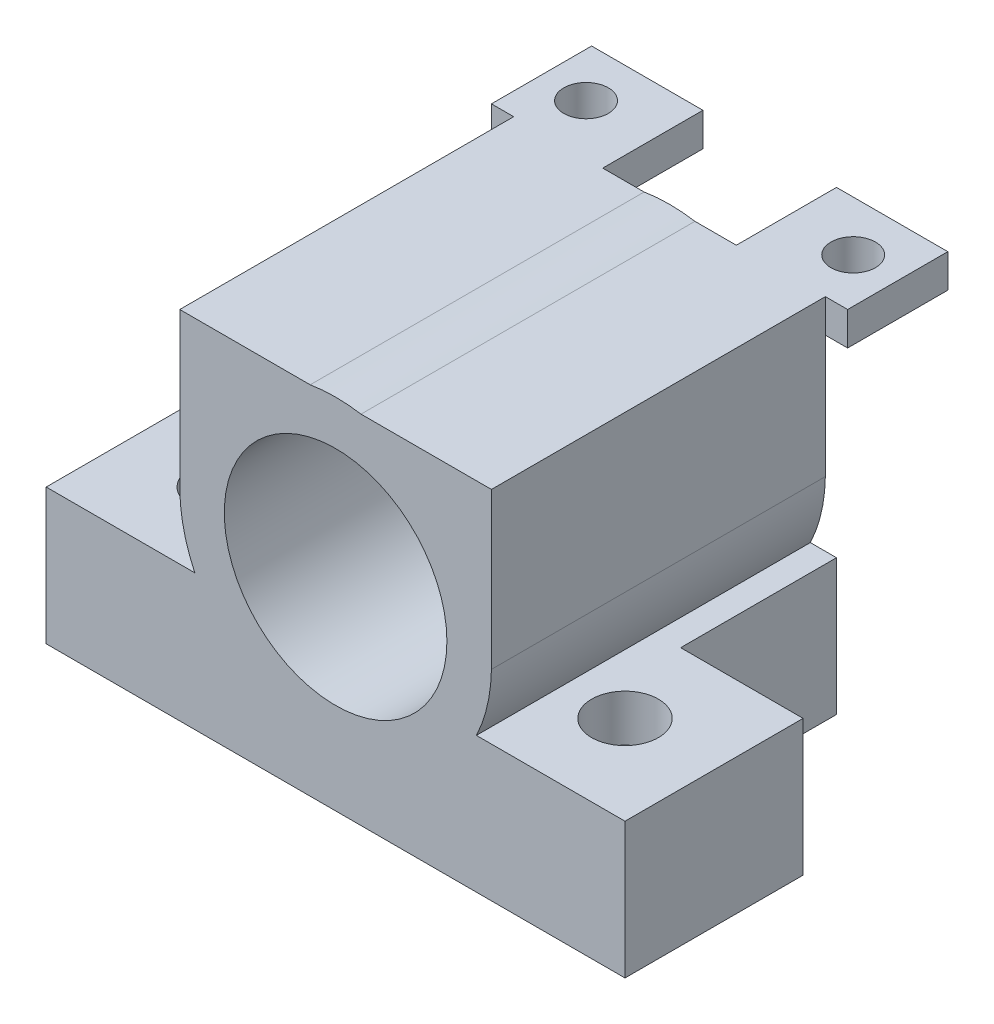
ISO-10303-21;
HEADER;
FILE_DESCRIPTION(('STEP AP214'),'2;1');
FILE_NAME('part.step','',(''),(''),'','','');
FILE_SCHEMA(('AUTOMOTIVE_DESIGN { 1 0 10303 214 1 1 1 1 }'));
ENDSEC;
DATA;
#1=APPLICATION_CONTEXT('core data for automotive mechanical design processes');
#2=APPLICATION_PROTOCOL_DEFINITION('international standard','automotive_design',2000,#1);
#3=PRODUCT_CONTEXT('',#1,'mechanical');
#4=PRODUCT('Part','Part','',(#3));
#5=PRODUCT_RELATED_PRODUCT_CATEGORY('part','',(#4));
#6=PRODUCT_DEFINITION_FORMATION('','',#4);
#7=PRODUCT_DEFINITION_CONTEXT('part definition',#1,'design');
#8=PRODUCT_DEFINITION('design','',#6,#7);
#9=PRODUCT_DEFINITION_SHAPE('','',#8);
#10=(LENGTH_UNIT() NAMED_UNIT(*) SI_UNIT(.MILLI.,.METRE.));
#11=(NAMED_UNIT(*) PLANE_ANGLE_UNIT() SI_UNIT($,.RADIAN.));
#12=(NAMED_UNIT(*) SI_UNIT($,.STERADIAN.) SOLID_ANGLE_UNIT());
#13=UNCERTAINTY_MEASURE_WITH_UNIT(LENGTH_MEASURE(1.E-05),#10,'distance_accuracy_value','');
#14=(GEOMETRIC_REPRESENTATION_CONTEXT(3) GLOBAL_UNCERTAINTY_ASSIGNED_CONTEXT((#13)) GLOBAL_UNIT_ASSIGNED_CONTEXT((#10,
#11,#12)) REPRESENTATION_CONTEXT('',''));
#15=CARTESIAN_POINT('',(0.,0.,0.));
#16=DIRECTION('',(0.,0.,1.));
#17=DIRECTION('',(1.,0.,0.));
#18=AXIS2_PLACEMENT_3D('',#15,#16,#17);
#19=CARTESIAN_POINT('',(0.,5.40634432154472,0.));
#20=DIRECTION('',(0.,1.,0.));
#21=DIRECTION('',(-1.,0.,0.));
#22=AXIS2_PLACEMENT_3D('',#19,#20,#21);
#23=PLANE('',#22);
#24=CARTESIAN_POINT('',(6.00000000000014,5.40634432154476,-9.25000000000001));
#25=DIRECTION('',(0.,1.,0.));
#26=DIRECTION('',(-1.,0.,0.));
#27=AXIS2_PLACEMENT_3D('',#24,#25,#26);
#28=CIRCLE('',#27,1.);
#29=CARTESIAN_POINT('',(5.00000000000014,5.40634432154475,-9.25000000000001));
#30=VERTEX_POINT('',#29);
#31=EDGE_CURVE('E312',#30,#30,#28,.T.);
#32=ORIENTED_EDGE('',*,*,#31,.T.);
#33=EDGE_LOOP('',(#32));
#34=FACE_BOUND('',#33,.T.);
#35=DIRECTION('',(-1.,0.,0.));
#36=VECTOR('',#35,1.);
#37=CARTESIAN_POINT('',(0.,5.40634432154472,-7.));
#38=LINE('',#37,#36);
#39=CARTESIAN_POINT('',(8.00000000000012,5.40634432154477,-6.99999999999999));
#40=VERTEX_POINT('',#39);
#41=CARTESIAN_POINT('',(6.99999999999996,5.40634432154476,-6.99999999999999));
#42=VERTEX_POINT('',#41);
#43=EDGE_CURVE('E302',#40,#42,#38,.T.);
#44=ORIENTED_EDGE('',*,*,#43,.T.);
#45=DIRECTION('',(1.,0.,0.));
#46=VECTOR('',#45,1.);
#47=CARTESIAN_POINT('',(0.,5.40634432154472,-7.));
#48=LINE('',#47,#46);
#49=CARTESIAN_POINT('',(3.00000000000012,5.40634432154474,-7.));
#50=VERTEX_POINT('',#49);
#51=EDGE_CURVE('E39',#50,#42,#48,.T.);
#52=ORIENTED_EDGE('',*,*,#51,.F.);
#53=DIRECTION('',(0.,0.,-1.));
#54=VECTOR('',#53,1.);
#55=CARTESIAN_POINT('',(3.00000000000005,5.40634432154474,0.));
#56=LINE('',#55,#54);
#57=CARTESIAN_POINT('',(3.00000000000017,5.40634432154474,-11.5));
#58=VERTEX_POINT('',#57);
#59=EDGE_CURVE('E309',#50,#58,#56,.T.);
#60=ORIENTED_EDGE('',*,*,#59,.T.);
#61=DIRECTION('',(1.,0.,0.));
#62=VECTOR('',#61,1.);
#63=CARTESIAN_POINT('',(0.,5.40634432154472,-11.5000000000001));
#64=LINE('',#63,#62);
#65=CARTESIAN_POINT('',(8.00000000000017,5.40634432154477,-11.5));
#66=VERTEX_POINT('',#65);
#67=EDGE_CURVE('E307',#58,#66,#64,.T.);
#68=ORIENTED_EDGE('',*,*,#67,.T.);
#69=DIRECTION('',(0.,0.,1.));
#70=VECTOR('',#69,1.);
#71=CARTESIAN_POINT('',(8.00000000000004,5.40634432154477,0.));
#72=LINE('',#71,#70);
#73=EDGE_CURVE('E305',#66,#40,#72,.T.);
#74=ORIENTED_EDGE('',*,*,#73,.T.);
#75=EDGE_LOOP('',(#44,#52,#60,#68,#74));
#76=FACE_BOUND('',#75,.T.);
#77=ADVANCED_FACE('F35',(#34,#76),#23,.F.);
#78=CARTESIAN_POINT('',(0.,0.,0.));
#79=DIRECTION('',(0.,0.,1.));
#80=DIRECTION('',(1.,0.,0.));
#81=AXIS2_PLACEMENT_3D('',#78,#79,#80);
#82=CYLINDRICAL_SURFACE('',#81,5.);
#83=CARTESIAN_POINT('',(0.,0.,8.));
#84=DIRECTION('',(0.,0.,1.));
#85=DIRECTION('',(1.,0.,0.));
#86=AXIS2_PLACEMENT_3D('',#83,#84,#85);
#87=CIRCLE('',#86,5.);
#88=CARTESIAN_POINT('',(5.,0.,8.));
#89=VERTEX_POINT('',#88);
#90=EDGE_CURVE('E424',#89,#89,#87,.T.);
#91=ORIENTED_EDGE('',*,*,#90,.T.);
#92=EDGE_LOOP('',(#91));
#93=FACE_BOUND('',#92,.T.);
#94=CARTESIAN_POINT('',(0.,0.,-7.));
#95=DIRECTION('',(0.,0.,-1.));
#96=DIRECTION('',(-1.,0.,0.));
#97=AXIS2_PLACEMENT_3D('',#94,#95,#96);
#98=CIRCLE('',#97,5.);
#99=CARTESIAN_POINT('',(-5.,0.,-7.));
#100=VERTEX_POINT('',#99);
#101=EDGE_CURVE('E414',#100,#100,#98,.F.);
#102=ORIENTED_EDGE('',*,*,#101,.F.);
#103=EDGE_LOOP('',(#102));
#104=FACE_BOUND('',#103,.T.);
#105=ADVANCED_FACE('F520',(#93,#104),#82,.F.);
#106=CARTESIAN_POINT('',(-6.00000000000002,5.40634432154468,-9.25000000000014));
#107=DIRECTION('',(0.,1.,0.));
#108=DIRECTION('',(-1.,0.,0.));
#109=AXIS2_PLACEMENT_3D('',#106,#107,#108);
#110=CIRCLE('',#109,1.);
#111=CARTESIAN_POINT('',(-7.00000000000002,5.40634432154467,-9.25000000000014));
#112=VERTEX_POINT('',#111);
#113=EDGE_CURVE('E291',#112,#112,#110,.T.);
#114=ORIENTED_EDGE('',*,*,#113,.T.);
#115=EDGE_LOOP('',(#114));
#116=FACE_BOUND('',#115,.T.);
#117=CARTESIAN_POINT('',(-7.00000000000004,5.40634432154467,-7.));
#118=VERTEX_POINT('',#117);
#119=CARTESIAN_POINT('',(-3.00000000000001,5.4063443215447,-7.));
#120=VERTEX_POINT('',#119);
#121=EDGE_CURVE('E11',#118,#120,#48,.T.);
#122=ORIENTED_EDGE('',*,*,#121,.F.);
#123=DIRECTION('',(-1.,0.,0.));
#124=VECTOR('',#123,1.);
#125=CARTESIAN_POINT('',(0.,5.40634432154472,-6.99999999999993));
#126=LINE('',#125,#124);
#127=CARTESIAN_POINT('',(-8.00000000000004,5.40634432154466,-7.00000000000001));
#128=VERTEX_POINT('',#127);
#129=EDGE_CURVE('E300',#118,#128,#126,.T.);
#130=ORIENTED_EDGE('',*,*,#129,.T.);
#131=DIRECTION('',(0.,0.,1.));
#132=VECTOR('',#131,1.);
#133=CARTESIAN_POINT('',(-8.00000000000011,5.40634432154466,0.));
#134=LINE('',#133,#132);
#135=CARTESIAN_POINT('',(-7.99999999999999,5.40634432154466,-11.5000000000002));
#136=VERTEX_POINT('',#135);
#137=EDGE_CURVE('E297',#136,#128,#134,.T.);
#138=ORIENTED_EDGE('',*,*,#137,.F.);
#139=DIRECTION('',(1.,0.,0.));
#140=VECTOR('',#139,1.);
#141=CARTESIAN_POINT('',(0.,5.40634432154472,-11.5000000000001));
#142=LINE('',#141,#140);
#143=CARTESIAN_POINT('',(-2.99999999999999,5.4063443215447,-11.5000000000001));
#144=VERTEX_POINT('',#143);
#145=EDGE_CURVE('E294',#136,#144,#142,.T.);
#146=ORIENTED_EDGE('',*,*,#145,.T.);
#147=DIRECTION('',(0.,0.,-1.));
#148=VECTOR('',#147,1.);
#149=CARTESIAN_POINT('',(-3.00000000000011,5.4063443215447,0.));
#150=LINE('',#149,#148);
#151=EDGE_CURVE('E50',#120,#144,#150,.T.);
#152=ORIENTED_EDGE('',*,*,#151,.F.);
#153=EDGE_LOOP('',(#122,#130,#138,#146,#152));
#154=FACE_BOUND('',#153,.T.);
#155=ADVANCED_FACE('F523',(#116,#154),#23,.F.);
#156=CARTESIAN_POINT('',(0.,0.,8.));
#157=DIRECTION('',(0.,0.,-1.));
#158=DIRECTION('',(-1.,0.,0.));
#159=AXIS2_PLACEMENT_3D('',#156,#157,#158);
#160=CYLINDRICAL_SURFACE('',#159,7.);
#161=CARTESIAN_POINT('',(0.,0.,-7.));
#162=DIRECTION('',(0.,0.,-1.));
#163=DIRECTION('',(-1.,0.,0.));
#164=AXIS2_PLACEMENT_3D('',#161,#162,#163);
#165=CIRCLE('',#164,7.);
#166=CARTESIAN_POINT('',(6.99937344438008,-0.0936556784552351,-6.99999999999999));
#167=VERTEX_POINT('',#166);
#168=CARTESIAN_POINT('',(6.32455532033676,-3.,-7.));
#169=VERTEX_POINT('',#168);
#170=EDGE_CURVE('E405',#167,#169,#165,.T.);
#171=ORIENTED_EDGE('',*,*,#170,.F.);
#172=DIRECTION('',(0.,0.,-1.));
#173=VECTOR('',#172,1.);
#174=CARTESIAN_POINT('',(6.99937344438008,-0.0936556784552351,8.));
#175=LINE('',#174,#173);
#176=CARTESIAN_POINT('',(6.99937344438008,-0.0936556784552351,8.));
#177=VERTEX_POINT('',#176);
#178=EDGE_CURVE('E273',#167,#177,#175,.F.);
#179=ORIENTED_EDGE('',*,*,#178,.T.);
#180=CARTESIAN_POINT('',(0.,0.,8.));
#181=DIRECTION('',(0.,0.,1.));
#182=DIRECTION('',(1.,0.,0.));
#183=AXIS2_PLACEMENT_3D('',#180,#181,#182);
#184=CIRCLE('',#183,7.);
#185=CARTESIAN_POINT('',(6.32455532033676,-3.,8.));
#186=VERTEX_POINT('',#185);
#187=EDGE_CURVE('E433',#186,#177,#184,.T.);
#188=ORIENTED_EDGE('',*,*,#187,.F.);
#189=DIRECTION('',(0.,0.,-1.));
#190=VECTOR('',#189,1.);
#191=CARTESIAN_POINT('',(6.32455532033676,-3.,8.));
#192=LINE('',#191,#190);
#193=EDGE_CURVE('E448',#186,#169,#192,.T.);
#194=ORIENTED_EDGE('',*,*,#193,.T.);
#195=EDGE_LOOP('',(#171,#179,#188,#194));
#196=FACE_BOUND('',#195,.T.);
#197=ADVANCED_FACE('F476',(#196),#160,.T.);
#198=CARTESIAN_POINT('',(-6.99937344438008,-0.0936556784553328,8.));
#199=VERTEX_POINT('',#198);
#200=CARTESIAN_POINT('',(-6.32455532033676,-3.,8.));
#201=VERTEX_POINT('',#200);
#202=EDGE_CURVE('E431',#199,#201,#184,.T.);
#203=ORIENTED_EDGE('',*,*,#202,.F.);
#204=DIRECTION('',(0.,0.,-1.));
#205=VECTOR('',#204,1.);
#206=CARTESIAN_POINT('',(-6.99937344438008,-0.0936556784553328,8.));
#207=LINE('',#206,#205);
#208=CARTESIAN_POINT('',(-6.99937344438008,-0.0936556784553328,-7.));
#209=VERTEX_POINT('',#208);
#210=EDGE_CURVE('E287',#199,#209,#207,.T.);
#211=ORIENTED_EDGE('',*,*,#210,.T.);
#212=CARTESIAN_POINT('',(-6.32455532033676,-3.,-7.));
#213=VERTEX_POINT('',#212);
#214=EDGE_CURVE('E406',#213,#209,#165,.T.);
#215=ORIENTED_EDGE('',*,*,#214,.F.);
#216=DIRECTION('',(0.,0.,-1.));
#217=VECTOR('',#216,1.);
#218=CARTESIAN_POINT('',(-6.32455532033676,-3.,8.));
#219=LINE('',#218,#217);
#220=EDGE_CURVE('E447',#201,#213,#219,.T.);
#221=ORIENTED_EDGE('',*,*,#220,.F.);
#222=EDGE_LOOP('',(#203,#211,#215,#221));
#223=FACE_BOUND('',#222,.T.);
#224=ADVANCED_FACE('F538',(#223),#160,.T.);
#225=CARTESIAN_POINT('',(0.,0.,0.));
#226=DIRECTION('',(0.,0.,1.));
#227=DIRECTION('',(1.,0.,0.));
#228=AXIS2_PLACEMENT_3D('',#225,#226,#227);
#229=PLANE('',#228);
#230=DIRECTION('',(0.,-1.,0.));
#231=VECTOR('',#230,1.);
#232=CARTESIAN_POINT('',(7.5,0.,0.));
#233=LINE('',#232,#231);
#234=CARTESIAN_POINT('',(7.5,-3.,0.));
#235=VERTEX_POINT('',#234);
#236=CARTESIAN_POINT('',(7.5,-9.1,0.));
#237=VERTEX_POINT('',#236);
#238=EDGE_CURVE('E402',#235,#237,#233,.T.);
#239=ORIENTED_EDGE('',*,*,#238,.F.);
#240=DIRECTION('',(1.,0.,0.));
#241=VECTOR('',#240,1.);
#242=CARTESIAN_POINT('',(0.,-3.,0.));
#243=LINE('',#242,#241);
#244=CARTESIAN_POINT('',(13.,-3.,0.));
#245=VERTEX_POINT('',#244);
#246=EDGE_CURVE('E427',#235,#245,#243,.T.);
#247=ORIENTED_EDGE('',*,*,#246,.T.);
#248=DIRECTION('',(0.,-1.,0.));
#249=VECTOR('',#248,1.);
#250=CARTESIAN_POINT('',(13.,0.,0.));
#251=LINE('',#250,#249);
#252=CARTESIAN_POINT('',(13.,-9.1,0.));
#253=VERTEX_POINT('',#252);
#254=EDGE_CURVE('E432',#245,#253,#251,.T.);
#255=ORIENTED_EDGE('',*,*,#254,.T.);
#256=DIRECTION('',(1.,0.,0.));
#257=VECTOR('',#256,1.);
#258=CARTESIAN_POINT('',(7.5,-9.1,0.));
#259=LINE('',#258,#257);
#260=EDGE_CURVE('E260',#237,#253,#259,.T.);
#261=ORIENTED_EDGE('',*,*,#260,.F.);
#262=EDGE_LOOP('',(#239,#247,#255,#261));
#263=FACE_BOUND('',#262,.T.);
#264=ADVANCED_FACE('F504',(#263),#229,.F.);
#265=CARTESIAN_POINT('',(0.,-3.,8.));
#266=DIRECTION('',(0.,1.,0.));
#267=DIRECTION('',(-1.,0.,0.));
#268=AXIS2_PLACEMENT_3D('',#265,#266,#267);
#269=PLANE('',#268);
#270=CARTESIAN_POINT('',(9.,-3.,4.));
#271=DIRECTION('',(0.,1.,0.));
#272=DIRECTION('',(-1.,0.,0.));
#273=AXIS2_PLACEMENT_3D('',#270,#271,#272);
#274=CIRCLE('',#273,1.5);
#275=CARTESIAN_POINT('',(7.5,-3.,4.));
#276=VERTEX_POINT('',#275);
#277=EDGE_CURVE('E386',#276,#276,#274,.T.);
#278=ORIENTED_EDGE('',*,*,#277,.F.);
#279=EDGE_LOOP('',(#278));
#280=FACE_BOUND('',#279,.T.);
#281=ORIENTED_EDGE('',*,*,#246,.F.);
#282=DIRECTION('',(0.,0.,1.));
#283=VECTOR('',#282,1.);
#284=CARTESIAN_POINT('',(7.5,-3.,-7.));
#285=LINE('',#284,#283);
#286=CARTESIAN_POINT('',(7.5,-3.,-7.));
#287=VERTEX_POINT('',#286);
#288=EDGE_CURVE('E417',#287,#235,#285,.T.);
#289=ORIENTED_EDGE('',*,*,#288,.F.);
#290=DIRECTION('',(1.,0.,0.));
#291=VECTOR('',#290,1.);
#292=CARTESIAN_POINT('',(0.,-3.,-7.));
#293=LINE('',#292,#291);
#294=EDGE_CURVE('E409',#169,#287,#293,.T.);
#295=ORIENTED_EDGE('',*,*,#294,.F.);
#296=ORIENTED_EDGE('',*,*,#193,.F.);
#297=DIRECTION('',(1.,0.,0.));
#298=VECTOR('',#297,1.);
#299=CARTESIAN_POINT('',(0.,-3.,8.));
#300=LINE('',#299,#298);
#301=CARTESIAN_POINT('',(13.,-3.,8.));
#302=VERTEX_POINT('',#301);
#303=EDGE_CURVE('E428',#186,#302,#300,.T.);
#304=ORIENTED_EDGE('',*,*,#303,.T.);
#305=DIRECTION('',(0.,0.,-1.));
#306=VECTOR('',#305,1.);
#307=CARTESIAN_POINT('',(13.,-3.,8.));
#308=LINE('',#307,#306);
#309=EDGE_CURVE('E438',#302,#245,#308,.T.);
#310=ORIENTED_EDGE('',*,*,#309,.T.);
#311=EDGE_LOOP('',(#281,#289,#295,#296,#304,#310));
#312=FACE_BOUND('',#311,.T.);
#313=ADVANCED_FACE('F37',(#280,#312),#269,.T.);
#314=CARTESIAN_POINT('',(1.14123096359455,6.90634432154472,8.));
#315=VERTEX_POINT('',#314);
#316=CARTESIAN_POINT('',(-1.14123096359464,6.90634432154471,8.));
#317=VERTEX_POINT('',#316);
#318=EDGE_CURVE('E435',#315,#317,#184,.T.);
#319=ORIENTED_EDGE('',*,*,#318,.F.);
#320=DIRECTION('',(0.,0.,-1.));
#321=VECTOR('',#320,1.);
#322=CARTESIAN_POINT('',(1.14123096359455,6.90634432154472,8.));
#323=LINE('',#322,#321);
#324=CARTESIAN_POINT('',(1.14123096359455,6.90634432154472,-7.));
#325=VERTEX_POINT('',#324);
#326=EDGE_CURVE('E383',#315,#325,#323,.T.);
#327=ORIENTED_EDGE('',*,*,#326,.T.);
#328=CARTESIAN_POINT('',(-1.14123096359464,6.90634432154471,-7.));
#329=VERTEX_POINT('',#328);
#330=EDGE_CURVE('E410',#329,#325,#165,.T.);
#331=ORIENTED_EDGE('',*,*,#330,.F.);
#332=DIRECTION('',(0.,0.,-1.));
#333=VECTOR('',#332,1.);
#334=CARTESIAN_POINT('',(-1.14123096359464,6.90634432154471,8.));
#335=LINE('',#334,#333);
#336=EDGE_CURVE('E355',#329,#317,#335,.F.);
#337=ORIENTED_EDGE('',*,*,#336,.T.);
#338=EDGE_LOOP('',(#319,#327,#331,#337));
#339=FACE_BOUND('',#338,.T.);
#340=ADVANCED_FACE('F483',(#339),#160,.T.);
#341=CARTESIAN_POINT('',(0.,-3.,8.));
#342=DIRECTION('',(0.,-1.,0.));
#343=DIRECTION('',(1.,0.,0.));
#344=AXIS2_PLACEMENT_3D('',#341,#342,#343);
#345=PLANE('',#344);
#346=CARTESIAN_POINT('',(-9.,-3.,4.));
#347=DIRECTION('',(0.,1.,0.));
#348=DIRECTION('',(-1.,0.,0.));
#349=AXIS2_PLACEMENT_3D('',#346,#347,#348);
#350=CIRCLE('',#349,1.5);
#351=CARTESIAN_POINT('',(-10.5,-3.,4.));
#352=VERTEX_POINT('',#351);
#353=EDGE_CURVE('E391',#352,#352,#350,.T.);
#354=ORIENTED_EDGE('',*,*,#353,.F.);
#355=EDGE_LOOP('',(#354));
#356=FACE_BOUND('',#355,.T.);
#357=ORIENTED_EDGE('',*,*,#220,.T.);
#358=DIRECTION('',(1.,0.,0.));
#359=VECTOR('',#358,1.);
#360=CARTESIAN_POINT('',(0.,-3.,-7.));
#361=LINE('',#360,#359);
#362=CARTESIAN_POINT('',(-7.5,-3.,-7.));
#363=VERTEX_POINT('',#362);
#364=EDGE_CURVE('E401',#363,#213,#361,.T.);
#365=ORIENTED_EDGE('',*,*,#364,.F.);
#366=DIRECTION('',(0.,0.,1.));
#367=VECTOR('',#366,1.);
#368=CARTESIAN_POINT('',(-7.5,-3.,-7.));
#369=LINE('',#368,#367);
#370=CARTESIAN_POINT('',(-7.5,-3.,0.));
#371=VERTEX_POINT('',#370);
#372=EDGE_CURVE('E422',#363,#371,#369,.T.);
#373=ORIENTED_EDGE('',*,*,#372,.T.);
#374=DIRECTION('',(-1.,0.,0.));
#375=VECTOR('',#374,1.);
#376=CARTESIAN_POINT('',(0.,-3.,0.));
#377=LINE('',#376,#375);
#378=CARTESIAN_POINT('',(-13.,-3.,0.));
#379=VERTEX_POINT('',#378);
#380=EDGE_CURVE('E58',#371,#379,#377,.T.);
#381=ORIENTED_EDGE('',*,*,#380,.T.);
#382=DIRECTION('',(0.,0.,-1.));
#383=VECTOR('',#382,1.);
#384=CARTESIAN_POINT('',(-13.,-3.,8.));
#385=LINE('',#384,#383);
#386=CARTESIAN_POINT('',(-13.,-3.,8.));
#387=VERTEX_POINT('',#386);
#388=EDGE_CURVE('E445',#387,#379,#385,.T.);
#389=ORIENTED_EDGE('',*,*,#388,.F.);
#390=DIRECTION('',(-1.,0.,0.));
#391=VECTOR('',#390,1.);
#392=CARTESIAN_POINT('',(0.,-3.,8.));
#393=LINE('',#392,#391);
#394=EDGE_CURVE('E222',#201,#387,#393,.T.);
#395=ORIENTED_EDGE('',*,*,#394,.F.);
#396=EDGE_LOOP('',(#357,#365,#373,#381,#389,#395));
#397=FACE_BOUND('',#396,.T.);
#398=ADVANCED_FACE('F516',(#356,#397),#345,.F.);
#399=CARTESIAN_POINT('',(-13.,0.,8.));
#400=DIRECTION('',(1.,0.,0.));
#401=DIRECTION('',(0.,0.,-1.));
#402=AXIS2_PLACEMENT_3D('',#399,#400,#401);
#403=PLANE('',#402);
#404=DIRECTION('',(0.,-1.,0.));
#405=VECTOR('',#404,1.);
#406=CARTESIAN_POINT('',(-13.,0.,0.));
#407=LINE('',#406,#405);
#408=CARTESIAN_POINT('',(-13.,-9.1,0.));
#409=VERTEX_POINT('',#408);
#410=EDGE_CURVE('E231',#379,#409,#407,.T.);
#411=ORIENTED_EDGE('',*,*,#410,.T.);
#412=DIRECTION('',(0.,0.,-1.));
#413=VECTOR('',#412,1.);
#414=CARTESIAN_POINT('',(-13.,-9.1,8.));
#415=LINE('',#414,#413);
#416=CARTESIAN_POINT('',(-13.,-9.1,8.));
#417=VERTEX_POINT('',#416);
#418=EDGE_CURVE('E229',#417,#409,#415,.T.);
#419=ORIENTED_EDGE('',*,*,#418,.F.);
#420=DIRECTION('',(0.,-1.,0.));
#421=VECTOR('',#420,1.);
#422=CARTESIAN_POINT('',(-13.,0.,8.));
#423=LINE('',#422,#421);
#424=EDGE_CURVE('E214',#387,#417,#423,.T.);
#425=ORIENTED_EDGE('',*,*,#424,.F.);
#426=ORIENTED_EDGE('',*,*,#388,.T.);
#427=EDGE_LOOP('',(#411,#419,#425,#426));
#428=FACE_BOUND('',#427,.T.);
#429=ADVANCED_FACE('F230',(#428),#403,.F.);
#430=CARTESIAN_POINT('',(13.,0.,8.));
#431=DIRECTION('',(1.,0.,0.));
#432=DIRECTION('',(0.,0.,-1.));
#433=AXIS2_PLACEMENT_3D('',#430,#431,#432);
#434=PLANE('',#433);
#435=ORIENTED_EDGE('',*,*,#254,.F.);
#436=ORIENTED_EDGE('',*,*,#309,.F.);
#437=DIRECTION('',(0.,-1.,0.));
#438=VECTOR('',#437,1.);
#439=CARTESIAN_POINT('',(13.,0.,8.));
#440=LINE('',#439,#438);
#441=CARTESIAN_POINT('',(13.,-9.1,8.));
#442=VERTEX_POINT('',#441);
#443=EDGE_CURVE('E226',#302,#442,#440,.T.);
#444=ORIENTED_EDGE('',*,*,#443,.T.);
#445=DIRECTION('',(0.,0.,1.));
#446=VECTOR('',#445,1.);
#447=CARTESIAN_POINT('',(13.,-9.1,0.));
#448=LINE('',#447,#446);
#449=EDGE_CURVE('E242',#253,#442,#448,.T.);
#450=ORIENTED_EDGE('',*,*,#449,.F.);
#451=EDGE_LOOP('',(#435,#436,#444,#450));
#452=FACE_BOUND('',#451,.T.);
#453=ADVANCED_FACE('F506',(#452),#434,.T.);
#454=CARTESIAN_POINT('',(0.,0.,8.));
#455=DIRECTION('',(0.,0.,1.));
#456=DIRECTION('',(1.,0.,0.));
#457=AXIS2_PLACEMENT_3D('',#454,#455,#456);
#458=PLANE('',#457);
#459=ORIENTED_EDGE('',*,*,#90,.F.);
#460=EDGE_LOOP('',(#459));
#461=FACE_BOUND('',#460,.T.);
#462=ORIENTED_EDGE('',*,*,#187,.T.);
#463=DIRECTION('',(1.,0.,0.));
#464=VECTOR('',#463,1.);
#465=CARTESIAN_POINT('',(0.,-0.0936556784552839,8.));
#466=LINE('',#465,#464);
#467=CARTESIAN_POINT('',(7.,-0.0936556784552353,8.));
#468=VERTEX_POINT('',#467);
#469=EDGE_CURVE('E268',#177,#468,#466,.T.);
#470=ORIENTED_EDGE('',*,*,#469,.T.);
#471=DIRECTION('',(0.,1.,0.));
#472=VECTOR('',#471,1.);
#473=CARTESIAN_POINT('',(6.99999999999996,5.40634432154476,8.));
#474=LINE('',#473,#472);
#475=CARTESIAN_POINT('',(6.99999999999995,6.90634432154477,8.));
#476=VERTEX_POINT('',#475);
#477=EDGE_CURVE('E371',#468,#476,#474,.T.);
#478=ORIENTED_EDGE('',*,*,#477,.T.);
#479=DIRECTION('',(1.,0.,0.));
#480=VECTOR('',#479,1.);
#481=CARTESIAN_POINT('',(0.,6.90634432154472,8.));
#482=LINE('',#481,#480);
#483=EDGE_CURVE('E330',#315,#476,#482,.T.);
#484=ORIENTED_EDGE('',*,*,#483,.F.);
#485=ORIENTED_EDGE('',*,*,#318,.T.);
#486=CARTESIAN_POINT('',(-7.00000000000005,6.90634432154467,8.));
#487=VERTEX_POINT('',#486);
#488=EDGE_CURVE('E331',#487,#317,#482,.T.);
#489=ORIENTED_EDGE('',*,*,#488,.F.);
#490=DIRECTION('',(0.,1.,0.));
#491=VECTOR('',#490,1.);
#492=CARTESIAN_POINT('',(-7.00000000000004,5.40634432154467,8.));
#493=LINE('',#492,#491);
#494=CARTESIAN_POINT('',(-7.,-0.0936556784553325,8.));
#495=VERTEX_POINT('',#494);
#496=EDGE_CURVE('E374',#495,#487,#493,.T.);
#497=ORIENTED_EDGE('',*,*,#496,.F.);
#498=DIRECTION('',(-1.,0.,0.));
#499=VECTOR('',#498,1.);
#500=CARTESIAN_POINT('',(0.,-0.0936556784552839,8.));
#501=LINE('',#500,#499);
#502=EDGE_CURVE('E281',#199,#495,#501,.T.);
#503=ORIENTED_EDGE('',*,*,#502,.F.);
#504=ORIENTED_EDGE('',*,*,#202,.T.);
#505=ORIENTED_EDGE('',*,*,#394,.T.);
#506=ORIENTED_EDGE('',*,*,#424,.T.);
#507=DIRECTION('',(-1.,0.,0.));
#508=VECTOR('',#507,1.);
#509=CARTESIAN_POINT('',(13.,-9.1,8.));
#510=LINE('',#509,#508);
#511=EDGE_CURVE('E220',#442,#417,#510,.T.);
#512=ORIENTED_EDGE('',*,*,#511,.F.);
#513=ORIENTED_EDGE('',*,*,#443,.F.);
#514=ORIENTED_EDGE('',*,*,#303,.F.);
#515=EDGE_LOOP('',(#462,#470,#478,#484,#485,#489,#497,#503,#504,#505,#506,#512,#513,#514));
#516=FACE_BOUND('',#515,.T.);
#517=ADVANCED_FACE('F217',(#461,#516),#458,.T.);
#518=ORIENTED_EDGE('',*,*,#380,.F.);
#519=DIRECTION('',(0.,-1.,0.));
#520=VECTOR('',#519,1.);
#521=CARTESIAN_POINT('',(-7.5,0.,0.));
#522=LINE('',#521,#520);
#523=CARTESIAN_POINT('',(-7.5,-9.1,0.));
#524=VERTEX_POINT('',#523);
#525=EDGE_CURVE('E390',#371,#524,#522,.T.);
#526=ORIENTED_EDGE('',*,*,#525,.T.);
#527=DIRECTION('',(1.,0.,0.));
#528=VECTOR('',#527,1.);
#529=CARTESIAN_POINT('',(-13.,-9.1,0.));
#530=LINE('',#529,#528);
#531=EDGE_CURVE('E235',#409,#524,#530,.T.);
#532=ORIENTED_EDGE('',*,*,#531,.F.);
#533=ORIENTED_EDGE('',*,*,#410,.F.);
#534=EDGE_LOOP('',(#518,#526,#532,#533));
#535=FACE_BOUND('',#534,.T.);
#536=ADVANCED_FACE('F513',(#535),#229,.F.);
#537=CARTESIAN_POINT('',(-7.5,0.,-7.));
#538=DIRECTION('',(-1.,0.,0.));
#539=DIRECTION('',(0.,0.,1.));
#540=AXIS2_PLACEMENT_3D('',#537,#538,#539);
#541=PLANE('',#540);
#542=ORIENTED_EDGE('',*,*,#525,.F.);
#543=ORIENTED_EDGE('',*,*,#372,.F.);
#544=DIRECTION('',(0.,-1.,0.));
#545=VECTOR('',#544,1.);
#546=CARTESIAN_POINT('',(-7.5,0.,-7.));
#547=LINE('',#546,#545);
#548=CARTESIAN_POINT('',(-7.50000000000004,-9.1,-7.));
#549=VERTEX_POINT('',#548);
#550=EDGE_CURVE('E399',#363,#549,#547,.T.);
#551=ORIENTED_EDGE('',*,*,#550,.T.);
#552=DIRECTION('',(0.,0.,-1.));
#553=VECTOR('',#552,1.);
#554=CARTESIAN_POINT('',(-7.5,-9.1,0.));
#555=LINE('',#554,#553);
#556=EDGE_CURVE('E251',#524,#549,#555,.T.);
#557=ORIENTED_EDGE('',*,*,#556,.F.);
#558=EDGE_LOOP('',(#542,#543,#551,#557));
#559=FACE_BOUND('',#558,.T.);
#560=ADVANCED_FACE('F576',(#559),#541,.T.);
#561=CARTESIAN_POINT('',(7.5,0.,-7.));
#562=DIRECTION('',(-1.,0.,0.));
#563=DIRECTION('',(0.,0.,1.));
#564=AXIS2_PLACEMENT_3D('',#561,#562,#563);
#565=PLANE('',#564);
#566=ORIENTED_EDGE('',*,*,#238,.T.);
#567=DIRECTION('',(0.,0.,1.));
#568=VECTOR('',#567,1.);
#569=CARTESIAN_POINT('',(7.50000000000004,-9.1,-6.99999999999999));
#570=LINE('',#569,#568);
#571=CARTESIAN_POINT('',(7.50000000000004,-9.1,-6.99999999999999));
#572=VERTEX_POINT('',#571);
#573=EDGE_CURVE('E257',#572,#237,#570,.T.);
#574=ORIENTED_EDGE('',*,*,#573,.F.);
#575=DIRECTION('',(0.,-1.,0.));
#576=VECTOR('',#575,1.);
#577=CARTESIAN_POINT('',(7.5,0.,-7.));
#578=LINE('',#577,#576);
#579=EDGE_CURVE('E412',#287,#572,#578,.T.);
#580=ORIENTED_EDGE('',*,*,#579,.F.);
#581=ORIENTED_EDGE('',*,*,#288,.T.);
#582=EDGE_LOOP('',(#566,#574,#580,#581));
#583=FACE_BOUND('',#582,.T.);
#584=ADVANCED_FACE('F502',(#583),#565,.F.);
#585=CARTESIAN_POINT('',(0.,0.,-7.));
#586=DIRECTION('',(0.,0.,-1.));
#587=DIRECTION('',(-1.,0.,0.));
#588=AXIS2_PLACEMENT_3D('',#585,#586,#587);
#589=PLANE('',#588);
#590=ORIENTED_EDGE('',*,*,#101,.T.);
#591=EDGE_LOOP('',(#590));
#592=FACE_BOUND('',#591,.T.);
#593=ORIENTED_EDGE('',*,*,#51,.T.);
#594=DIRECTION('',(0.,1.,0.));
#595=VECTOR('',#594,1.);
#596=CARTESIAN_POINT('',(7.,-0.0936556784552353,-6.99999999999999));
#597=LINE('',#596,#595);
#598=CARTESIAN_POINT('',(7.,-0.0936556784552353,-6.99999999999999));
#599=VERTEX_POINT('',#598);
#600=EDGE_CURVE('E271',#599,#42,#597,.T.);
#601=ORIENTED_EDGE('',*,*,#600,.F.);
#602=DIRECTION('',(1.,0.,0.));
#603=VECTOR('',#602,1.);
#604=CARTESIAN_POINT('',(0.,-0.0936556784552839,-7.));
#605=LINE('',#604,#603);
#606=EDGE_CURVE('E263',#167,#599,#605,.T.);
#607=ORIENTED_EDGE('',*,*,#606,.F.);
#608=ORIENTED_EDGE('',*,*,#170,.T.);
#609=ORIENTED_EDGE('',*,*,#294,.T.);
#610=ORIENTED_EDGE('',*,*,#579,.T.);
#611=DIRECTION('',(1.,0.,0.));
#612=VECTOR('',#611,1.);
#613=CARTESIAN_POINT('',(-7.50000000000004,-9.1,-7.));
#614=LINE('',#613,#612);
#615=EDGE_CURVE('E254',#549,#572,#614,.T.);
#616=ORIENTED_EDGE('',*,*,#615,.F.);
#617=ORIENTED_EDGE('',*,*,#550,.F.);
#618=ORIENTED_EDGE('',*,*,#364,.T.);
#619=ORIENTED_EDGE('',*,*,#214,.T.);
#620=DIRECTION('',(1.,0.,0.));
#621=VECTOR('',#620,1.);
#622=CARTESIAN_POINT('',(0.,-0.0936556784552839,-7.));
#623=LINE('',#622,#621);
#624=CARTESIAN_POINT('',(-7.,-0.0936556784553325,-7.));
#625=VERTEX_POINT('',#624);
#626=EDGE_CURVE('E279',#625,#209,#623,.T.);
#627=ORIENTED_EDGE('',*,*,#626,.F.);
#628=DIRECTION('',(0.,1.,0.));
#629=VECTOR('',#628,1.);
#630=CARTESIAN_POINT('',(-7.,-0.0936556784553325,-7.));
#631=LINE('',#630,#629);
#632=EDGE_CURVE('E284',#625,#118,#631,.T.);
#633=ORIENTED_EDGE('',*,*,#632,.T.);
#634=ORIENTED_EDGE('',*,*,#121,.T.);
#635=DIRECTION('',(0.,1.,0.));
#636=VECTOR('',#635,1.);
#637=CARTESIAN_POINT('',(-3.00000000000004,5.4063443215447,-7.));
#638=LINE('',#637,#636);
#639=CARTESIAN_POINT('',(-3.00000000000005,6.9063443215447,-7.));
#640=VERTEX_POINT('',#639);
#641=EDGE_CURVE('E356',#120,#640,#638,.T.);
#642=ORIENTED_EDGE('',*,*,#641,.T.);
#643=DIRECTION('',(-1.,0.,0.));
#644=VECTOR('',#643,1.);
#645=CARTESIAN_POINT('',(0.,6.90634432154472,-7.));
#646=LINE('',#645,#644);
#647=EDGE_CURVE('E345',#329,#640,#646,.T.);
#648=ORIENTED_EDGE('',*,*,#647,.F.);
#649=ORIENTED_EDGE('',*,*,#330,.T.);
#650=CARTESIAN_POINT('',(3.00000000000011,6.90634432154474,-7.));
#651=VERTEX_POINT('',#650);
#652=EDGE_CURVE('E346',#651,#325,#646,.T.);
#653=ORIENTED_EDGE('',*,*,#652,.F.);
#654=DIRECTION('',(0.,1.,0.));
#655=VECTOR('',#654,1.);
#656=CARTESIAN_POINT('',(3.00000000000012,5.40634432154474,-7.));
#657=LINE('',#656,#655);
#658=EDGE_CURVE('E358',#50,#651,#657,.T.);
#659=ORIENTED_EDGE('',*,*,#658,.F.);
#660=EDGE_LOOP('',(#593,#601,#607,#608,#609,#610,#616,#617,#618,#619,#627,#633,#634,#642,#648,
#649,#653,#659));
#661=FACE_BOUND('',#660,.T.);
#662=ADVANCED_FACE('F458',(#592,#661),#589,.T.);
#663=CARTESIAN_POINT('',(9.,-5.1,4.));
#664=DIRECTION('',(0.,1.,0.));
#665=DIRECTION('',(-1.,0.,0.));
#666=AXIS2_PLACEMENT_3D('',#663,#664,#665);
#667=CYLINDRICAL_SURFACE('',#666,1.5);
#668=CARTESIAN_POINT('',(9.,-5.1,4.));
#669=DIRECTION('',(0.,1.,0.));
#670=DIRECTION('',(-1.,0.,0.));
#671=AXIS2_PLACEMENT_3D('',#668,#669,#670);
#672=CIRCLE('',#671,1.5);
#673=CARTESIAN_POINT('',(7.5,-5.1,4.));
#674=VERTEX_POINT('',#673);
#675=EDGE_CURVE('E394',#674,#674,#672,.T.);
#676=ORIENTED_EDGE('',*,*,#675,.F.);
#677=EDGE_LOOP('',(#676));
#678=FACE_BOUND('',#677,.T.);
#679=ORIENTED_EDGE('',*,*,#277,.T.);
#680=EDGE_LOOP('',(#679));
#681=FACE_BOUND('',#680,.T.);
#682=ADVANCED_FACE('F587',(#678,#681),#667,.F.);
#683=CARTESIAN_POINT('',(-9.,-5.10000000000001,4.));
#684=DIRECTION('',(0.,1.,0.));
#685=DIRECTION('',(-1.,0.,0.));
#686=AXIS2_PLACEMENT_3D('',#683,#684,#685);
#687=CYLINDRICAL_SURFACE('',#686,1.5);
#688=CARTESIAN_POINT('',(-9.,-5.10000000000001,4.));
#689=DIRECTION('',(0.,1.,0.));
#690=DIRECTION('',(-1.,0.,0.));
#691=AXIS2_PLACEMENT_3D('',#688,#689,#690);
#692=CIRCLE('',#691,1.5);
#693=CARTESIAN_POINT('',(-10.5,-5.10000000000001,4.));
#694=VERTEX_POINT('',#693);
#695=EDGE_CURVE('E387',#694,#694,#692,.T.);
#696=ORIENTED_EDGE('',*,*,#695,.F.);
#697=EDGE_LOOP('',(#696));
#698=FACE_BOUND('',#697,.T.);
#699=ORIENTED_EDGE('',*,*,#353,.T.);
#700=EDGE_LOOP('',(#699));
#701=FACE_BOUND('',#700,.T.);
#702=ADVANCED_FACE('F591',(#698,#701),#687,.F.);
#703=CARTESIAN_POINT('',(6.99999999999996,5.40634432154476,0.));
#704=DIRECTION('',(1.,0.,0.));
#705=DIRECTION('',(0.,1.,0.));
#706=AXIS2_PLACEMENT_3D('',#703,#704,#705);
#707=PLANE('',#706);
#708=DIRECTION('',(0.,0.,-1.));
#709=VECTOR('',#708,1.);
#710=CARTESIAN_POINT('',(6.99999999999995,6.90634432154477,0.));
#711=LINE('',#710,#709);
#712=CARTESIAN_POINT('',(6.99999999999995,6.90634432154477,-7.));
#713=VERTEX_POINT('',#712);
#714=EDGE_CURVE('E333',#476,#713,#711,.T.);
#715=ORIENTED_EDGE('',*,*,#714,.F.);
#716=ORIENTED_EDGE('',*,*,#477,.F.);
#717=DIRECTION('',(0.,0.,-1.));
#718=VECTOR('',#717,1.);
#719=CARTESIAN_POINT('',(7.,-0.0936556784552353,0.));
#720=LINE('',#719,#718);
#721=EDGE_CURVE('E265',#468,#599,#720,.T.);
#722=ORIENTED_EDGE('',*,*,#721,.T.);
#723=ORIENTED_EDGE('',*,*,#600,.T.);
#724=DIRECTION('',(0.,1.,0.));
#725=VECTOR('',#724,1.);
#726=CARTESIAN_POINT('',(6.99999999999996,5.40634432154476,-7.));
#727=LINE('',#726,#725);
#728=EDGE_CURVE('E369',#42,#713,#727,.T.);
#729=ORIENTED_EDGE('',*,*,#728,.T.);
#730=EDGE_LOOP('',(#715,#716,#722,#723,#729));
#731=FACE_BOUND('',#730,.T.);
#732=ADVANCED_FACE('F472',(#731),#707,.T.);
#733=CARTESIAN_POINT('',(0.,5.40634432154472,-7.));
#734=DIRECTION('',(0.,0.,-1.));
#735=DIRECTION('',(-1.,0.,0.));
#736=AXIS2_PLACEMENT_3D('',#733,#734,#735);
#737=PLANE('',#736);
#738=DIRECTION('',(-1.,0.,0.));
#739=VECTOR('',#738,1.);
#740=CARTESIAN_POINT('',(0.,6.90634432154472,-7.));
#741=LINE('',#740,#739);
#742=CARTESIAN_POINT('',(8.00000000000011,6.90634432154477,-6.99999999999999));
#743=VERTEX_POINT('',#742);
#744=EDGE_CURVE('E336',#743,#713,#741,.T.);
#745=ORIENTED_EDGE('',*,*,#744,.T.);
#746=ORIENTED_EDGE('',*,*,#728,.F.);
#747=ORIENTED_EDGE('',*,*,#43,.F.);
#748=DIRECTION('',(0.,1.,0.));
#749=VECTOR('',#748,1.);
#750=CARTESIAN_POINT('',(8.00000000000012,5.40634432154477,-6.99999999999999));
#751=LINE('',#750,#749);
#752=EDGE_CURVE('E366',#40,#743,#751,.T.);
#753=ORIENTED_EDGE('',*,*,#752,.T.);
#754=EDGE_LOOP('',(#745,#746,#747,#753));
#755=FACE_BOUND('',#754,.T.);
#756=ADVANCED_FACE('F468',(#755),#737,.F.);
#757=CARTESIAN_POINT('',(8.00000000000004,5.40634432154477,0.));
#758=DIRECTION('',(-1.,0.,0.));
#759=DIRECTION('',(0.,0.,1.));
#760=AXIS2_PLACEMENT_3D('',#757,#758,#759);
#761=PLANE('',#760);
#762=DIRECTION('',(0.,0.,1.));
#763=VECTOR('',#762,1.);
#764=CARTESIAN_POINT('',(8.00000000000004,6.90634432154477,0.));
#765=LINE('',#764,#763);
#766=CARTESIAN_POINT('',(8.00000000000015,6.90634432154477,-11.5));
#767=VERTEX_POINT('',#766);
#768=EDGE_CURVE('E339',#767,#743,#765,.T.);
#769=ORIENTED_EDGE('',*,*,#768,.T.);
#770=ORIENTED_EDGE('',*,*,#752,.F.);
#771=ORIENTED_EDGE('',*,*,#73,.F.);
#772=DIRECTION('',(0.,1.,0.));
#773=VECTOR('',#772,1.);
#774=CARTESIAN_POINT('',(8.00000000000017,5.40634432154477,-11.5));
#775=LINE('',#774,#773);
#776=EDGE_CURVE('E363',#66,#767,#775,.T.);
#777=ORIENTED_EDGE('',*,*,#776,.T.);
#778=EDGE_LOOP('',(#769,#770,#771,#777));
#779=FACE_BOUND('',#778,.T.);
#780=ADVANCED_FACE('F611',(#779),#761,.F.);
#781=CARTESIAN_POINT('',(0.,5.40634432154472,-11.5000000000001));
#782=DIRECTION('',(0.,0.,1.));
#783=DIRECTION('',(1.,0.,0.));
#784=AXIS2_PLACEMENT_3D('',#781,#782,#783);
#785=PLANE('',#784);
#786=DIRECTION('',(1.,0.,0.));
#787=VECTOR('',#786,1.);
#788=CARTESIAN_POINT('',(0.,6.90634432154472,-11.5000000000001));
#789=LINE('',#788,#787);
#790=CARTESIAN_POINT('',(3.00000000000016,6.90634432154474,-11.5));
#791=VERTEX_POINT('',#790);
#792=EDGE_CURVE('E341',#791,#767,#789,.T.);
#793=ORIENTED_EDGE('',*,*,#792,.T.);
#794=ORIENTED_EDGE('',*,*,#776,.F.);
#795=ORIENTED_EDGE('',*,*,#67,.F.);
#796=DIRECTION('',(0.,1.,0.));
#797=VECTOR('',#796,1.);
#798=CARTESIAN_POINT('',(3.00000000000017,5.40634432154474,-11.5));
#799=LINE('',#798,#797);
#800=EDGE_CURVE('E360',#58,#791,#799,.T.);
#801=ORIENTED_EDGE('',*,*,#800,.T.);
#802=EDGE_LOOP('',(#793,#794,#795,#801));
#803=FACE_BOUND('',#802,.T.);
#804=ADVANCED_FACE('F614',(#803),#785,.F.);
#805=CARTESIAN_POINT('',(6.00000000000014,5.40634432154476,-9.25000000000001));
#806=DIRECTION('',(0.,1.,0.));
#807=DIRECTION('',(-1.,0.,0.));
#808=AXIS2_PLACEMENT_3D('',#805,#806,#807);
#809=CYLINDRICAL_SURFACE('',#808,1.);
#810=ORIENTED_EDGE('',*,*,#31,.F.);
#811=EDGE_LOOP('',(#810));
#812=FACE_BOUND('',#811,.T.);
#813=CARTESIAN_POINT('',(6.00000000000013,6.90634432154476,-9.25000000000001));
#814=DIRECTION('',(0.,1.,0.));
#815=DIRECTION('',(-1.,0.,0.));
#816=AXIS2_PLACEMENT_3D('',#813,#814,#815);
#817=CIRCLE('',#816,1.);
#818=CARTESIAN_POINT('',(5.00000000000013,6.90634432154475,-9.25000000000001));
#819=VERTEX_POINT('',#818);
#820=EDGE_CURVE('E295',#819,#819,#817,.T.);
#821=ORIENTED_EDGE('',*,*,#820,.T.);
#822=EDGE_LOOP('',(#821));
#823=FACE_BOUND('',#822,.T.);
#824=ADVANCED_FACE('F618',(#812,#823),#809,.F.);
#825=CARTESIAN_POINT('',(3.00000000000005,5.40634432154474,0.));
#826=DIRECTION('',(1.,0.,0.));
#827=DIRECTION('',(0.,0.,-1.));
#828=AXIS2_PLACEMENT_3D('',#825,#826,#827);
#829=PLANE('',#828);
#830=DIRECTION('',(0.,0.,-1.));
#831=VECTOR('',#830,1.);
#832=CARTESIAN_POINT('',(3.00000000000004,6.90634432154474,0.));
#833=LINE('',#832,#831);
#834=EDGE_CURVE('E343',#651,#791,#833,.T.);
#835=ORIENTED_EDGE('',*,*,#834,.T.);
#836=ORIENTED_EDGE('',*,*,#800,.F.);
#837=ORIENTED_EDGE('',*,*,#59,.F.);
#838=ORIENTED_EDGE('',*,*,#658,.T.);
#839=EDGE_LOOP('',(#835,#836,#837,#838));
#840=FACE_BOUND('',#839,.T.);
#841=ADVANCED_FACE('F620',(#840),#829,.F.);
#842=CARTESIAN_POINT('',(0.,6.90634432154472,0.));
#843=DIRECTION('',(0.,1.,0.));
#844=DIRECTION('',(-1.,0.,0.));
#845=AXIS2_PLACEMENT_3D('',#842,#843,#844);
#846=PLANE('',#845);
#847=ORIENTED_EDGE('',*,*,#820,.F.);
#848=EDGE_LOOP('',(#847));
#849=FACE_BOUND('',#848,.T.);
#850=ORIENTED_EDGE('',*,*,#326,.F.);
#851=ORIENTED_EDGE('',*,*,#483,.T.);
#852=ORIENTED_EDGE('',*,*,#714,.T.);
#853=ORIENTED_EDGE('',*,*,#744,.F.);
#854=ORIENTED_EDGE('',*,*,#768,.F.);
#855=ORIENTED_EDGE('',*,*,#792,.F.);
#856=ORIENTED_EDGE('',*,*,#834,.F.);
#857=ORIENTED_EDGE('',*,*,#652,.T.);
#858=EDGE_LOOP('',(#850,#851,#852,#853,#854,#855,#856,#857));
#859=FACE_BOUND('',#858,.T.);
#860=ADVANCED_FACE('F487',(#849,#859),#846,.T.);
#861=CARTESIAN_POINT('',(-6.00000000000003,6.90634432154468,-9.25000000000014));
#862=DIRECTION('',(0.,1.,0.));
#863=DIRECTION('',(-1.,0.,0.));
#864=AXIS2_PLACEMENT_3D('',#861,#862,#863);
#865=CIRCLE('',#864,1.);
#866=CARTESIAN_POINT('',(-7.00000000000003,6.90634432154467,-9.25000000000014));
#867=VERTEX_POINT('',#866);
#868=EDGE_CURVE('E290',#867,#867,#865,.T.);
#869=ORIENTED_EDGE('',*,*,#868,.F.);
#870=EDGE_LOOP('',(#869));
#871=FACE_BOUND('',#870,.T.);
#872=ORIENTED_EDGE('',*,*,#336,.F.);
#873=ORIENTED_EDGE('',*,*,#647,.T.);
#874=DIRECTION('',(0.,0.,-1.));
#875=VECTOR('',#874,1.);
#876=CARTESIAN_POINT('',(-3.00000000000012,6.9063443215447,0.));
#877=LINE('',#876,#875);
#878=CARTESIAN_POINT('',(-3.,6.9063443215447,-11.5000000000001));
#879=VERTEX_POINT('',#878);
#880=EDGE_CURVE('E348',#640,#879,#877,.T.);
#881=ORIENTED_EDGE('',*,*,#880,.T.);
#882=DIRECTION('',(1.,0.,0.));
#883=VECTOR('',#882,1.);
#884=CARTESIAN_POINT('',(0.,6.90634432154472,-11.5000000000001));
#885=LINE('',#884,#883);
#886=CARTESIAN_POINT('',(-8.,6.90634432154466,-11.5000000000002));
#887=VERTEX_POINT('',#886);
#888=EDGE_CURVE('E318',#887,#879,#885,.T.);
#889=ORIENTED_EDGE('',*,*,#888,.F.);
#890=DIRECTION('',(0.,0.,1.));
#891=VECTOR('',#890,1.);
#892=CARTESIAN_POINT('',(-8.00000000000012,6.90634432154466,0.));
#893=LINE('',#892,#891);
#894=CARTESIAN_POINT('',(-8.00000000000005,6.90634432154466,-7.00000000000001));
#895=VERTEX_POINT('',#894);
#896=EDGE_CURVE('E321',#887,#895,#893,.T.);
#897=ORIENTED_EDGE('',*,*,#896,.T.);
#898=DIRECTION('',(-1.,0.,0.));
#899=VECTOR('',#898,1.);
#900=CARTESIAN_POINT('',(0.,6.90634432154472,-6.99999999999993));
#901=LINE('',#900,#899);
#902=CARTESIAN_POINT('',(-7.00000000000005,6.90634432154467,-7.));
#903=VERTEX_POINT('',#902);
#904=EDGE_CURVE('E324',#903,#895,#901,.T.);
#905=ORIENTED_EDGE('',*,*,#904,.F.);
#906=DIRECTION('',(0.,0.,1.));
#907=VECTOR('',#906,1.);
#908=CARTESIAN_POINT('',(-7.00000000000005,6.90634432154467,0.));
#909=LINE('',#908,#907);
#910=EDGE_CURVE('E327',#903,#487,#909,.T.);
#911=ORIENTED_EDGE('',*,*,#910,.T.);
#912=ORIENTED_EDGE('',*,*,#488,.T.);
#913=EDGE_LOOP('',(#872,#873,#881,#889,#897,#905,#911,#912));
#914=FACE_BOUND('',#913,.T.);
#915=ADVANCED_FACE('F564',(#871,#914),#846,.T.);
#916=CARTESIAN_POINT('',(0.,5.40634432154472,-11.5000000000001));
#917=DIRECTION('',(0.,0.,1.));
#918=DIRECTION('',(1.,0.,0.));
#919=AXIS2_PLACEMENT_3D('',#916,#917,#918);
#920=PLANE('',#919);
#921=ORIENTED_EDGE('',*,*,#888,.T.);
#922=DIRECTION('',(0.,1.,0.));
#923=VECTOR('',#922,1.);
#924=CARTESIAN_POINT('',(-2.99999999999999,5.4063443215447,-11.5000000000001));
#925=LINE('',#924,#923);
#926=EDGE_CURVE('E353',#144,#879,#925,.T.);
#927=ORIENTED_EDGE('',*,*,#926,.F.);
#928=ORIENTED_EDGE('',*,*,#145,.F.);
#929=DIRECTION('',(0.,1.,0.));
#930=VECTOR('',#929,1.);
#931=CARTESIAN_POINT('',(-7.99999999999999,5.40634432154466,-11.5000000000002));
#932=LINE('',#931,#930);
#933=EDGE_CURVE('E315',#136,#887,#932,.T.);
#934=ORIENTED_EDGE('',*,*,#933,.T.);
#935=EDGE_LOOP('',(#921,#927,#928,#934));
#936=FACE_BOUND('',#935,.T.);
#937=ADVANCED_FACE('F558',(#936),#920,.F.);
#938=CARTESIAN_POINT('',(-3.00000000000011,5.4063443215447,0.));
#939=DIRECTION('',(1.,0.,0.));
#940=DIRECTION('',(0.,0.,-1.));
#941=AXIS2_PLACEMENT_3D('',#938,#939,#940);
#942=PLANE('',#941);
#943=ORIENTED_EDGE('',*,*,#880,.F.);
#944=ORIENTED_EDGE('',*,*,#641,.F.);
#945=ORIENTED_EDGE('',*,*,#151,.T.);
#946=ORIENTED_EDGE('',*,*,#926,.T.);
#947=EDGE_LOOP('',(#943,#944,#945,#946));
#948=FACE_BOUND('',#947,.T.);
#949=ADVANCED_FACE('F562',(#948),#942,.T.);
#950=CARTESIAN_POINT('',(-7.00000000000004,5.40634432154467,0.));
#951=DIRECTION('',(-1.,0.,0.));
#952=DIRECTION('',(0.,-1.,0.));
#953=AXIS2_PLACEMENT_3D('',#950,#951,#952);
#954=PLANE('',#953);
#955=ORIENTED_EDGE('',*,*,#910,.F.);
#956=DIRECTION('',(0.,1.,0.));
#957=VECTOR('',#956,1.);
#958=CARTESIAN_POINT('',(-7.00000000000004,5.40634432154467,-7.));
#959=LINE('',#958,#957);
#960=EDGE_CURVE('E376',#118,#903,#959,.T.);
#961=ORIENTED_EDGE('',*,*,#960,.F.);
#962=ORIENTED_EDGE('',*,*,#632,.F.);
#963=DIRECTION('',(0.,0.,-1.));
#964=VECTOR('',#963,1.);
#965=CARTESIAN_POINT('',(-7.,-0.0936556784553325,0.));
#966=LINE('',#965,#964);
#967=EDGE_CURVE('E276',#495,#625,#966,.T.);
#968=ORIENTED_EDGE('',*,*,#967,.F.);
#969=ORIENTED_EDGE('',*,*,#496,.T.);
#970=EDGE_LOOP('',(#955,#961,#962,#968,#969));
#971=FACE_BOUND('',#970,.T.);
#972=ADVANCED_FACE('F548',(#971),#954,.T.);
#973=CARTESIAN_POINT('',(0.,5.40634432154472,-6.99999999999993));
#974=DIRECTION('',(0.,0.,-1.));
#975=DIRECTION('',(-1.,0.,0.));
#976=AXIS2_PLACEMENT_3D('',#973,#974,#975);
#977=PLANE('',#976);
#978=ORIENTED_EDGE('',*,*,#904,.T.);
#979=DIRECTION('',(0.,1.,0.));
#980=VECTOR('',#979,1.);
#981=CARTESIAN_POINT('',(-8.00000000000004,5.40634432154466,-7.00000000000001));
#982=LINE('',#981,#980);
#983=EDGE_CURVE('E378',#128,#895,#982,.T.);
#984=ORIENTED_EDGE('',*,*,#983,.F.);
#985=ORIENTED_EDGE('',*,*,#129,.F.);
#986=ORIENTED_EDGE('',*,*,#960,.T.);
#987=EDGE_LOOP('',(#978,#984,#985,#986));
#988=FACE_BOUND('',#987,.T.);
#989=ADVANCED_FACE('F551',(#988),#977,.F.);
#990=CARTESIAN_POINT('',(-8.00000000000011,5.40634432154466,0.));
#991=DIRECTION('',(-1.,0.,0.));
#992=DIRECTION('',(0.,0.,1.));
#993=AXIS2_PLACEMENT_3D('',#990,#991,#992);
#994=PLANE('',#993);
#995=ORIENTED_EDGE('',*,*,#896,.F.);
#996=ORIENTED_EDGE('',*,*,#933,.F.);
#997=ORIENTED_EDGE('',*,*,#137,.T.);
#998=ORIENTED_EDGE('',*,*,#983,.T.);
#999=EDGE_LOOP('',(#995,#996,#997,#998));
#1000=FACE_BOUND('',#999,.T.);
#1001=ADVANCED_FACE('F554',(#1000),#994,.T.);
#1002=CARTESIAN_POINT('',(-6.00000000000002,5.40634432154468,-9.25000000000014));
#1003=DIRECTION('',(0.,1.,0.));
#1004=DIRECTION('',(-1.,0.,0.));
#1005=AXIS2_PLACEMENT_3D('',#1002,#1003,#1004);
#1006=CYLINDRICAL_SURFACE('',#1005,1.);
#1007=ORIENTED_EDGE('',*,*,#113,.F.);
#1008=EDGE_LOOP('',(#1007));
#1009=FACE_BOUND('',#1008,.T.);
#1010=ORIENTED_EDGE('',*,*,#868,.T.);
#1011=EDGE_LOOP('',(#1010));
#1012=FACE_BOUND('',#1011,.T.);
#1013=ADVANCED_FACE('F596',(#1009,#1012),#1006,.F.);
#1014=CARTESIAN_POINT('',(0.,-0.0936556784552839,0.));
#1015=DIRECTION('',(0.,-1.,0.));
#1016=DIRECTION('',(1.,0.,0.));
#1017=AXIS2_PLACEMENT_3D('',#1014,#1015,#1016);
#1018=PLANE('',#1017);
#1019=ORIENTED_EDGE('',*,*,#210,.F.);
#1020=ORIENTED_EDGE('',*,*,#502,.T.);
#1021=ORIENTED_EDGE('',*,*,#967,.T.);
#1022=ORIENTED_EDGE('',*,*,#626,.T.);
#1023=EDGE_LOOP('',(#1019,#1020,#1021,#1022));
#1024=FACE_BOUND('',#1023,.T.);
#1025=ADVANCED_FACE('F568',(#1024),#1018,.T.);
#1026=CARTESIAN_POINT('',(0.,-0.0936556784552839,0.));
#1027=DIRECTION('',(0.,-1.,0.));
#1028=DIRECTION('',(1.,0.,0.));
#1029=AXIS2_PLACEMENT_3D('',#1026,#1027,#1028);
#1030=PLANE('',#1029);
#1031=ORIENTED_EDGE('',*,*,#178,.F.);
#1032=ORIENTED_EDGE('',*,*,#606,.T.);
#1033=ORIENTED_EDGE('',*,*,#721,.F.);
#1034=ORIENTED_EDGE('',*,*,#469,.F.);
#1035=EDGE_LOOP('',(#1031,#1032,#1033,#1034));
#1036=FACE_BOUND('',#1035,.T.);
#1037=ADVANCED_FACE('F475',(#1036),#1030,.T.);
#1038=CARTESIAN_POINT('',(0.,-5.1,0.));
#1039=DIRECTION('',(0.,-1.,0.));
#1040=DIRECTION('',(1.,0.,0.));
#1041=AXIS2_PLACEMENT_3D('',#1038,#1039,#1040);
#1042=PLANE('',#1041);
#1043=CARTESIAN_POINT('',(-9.,-5.1,4.));
#1044=DIRECTION('',(0.,-1.,0.));
#1045=DIRECTION('',(1.,0.,0.));
#1046=AXIS2_PLACEMENT_3D('',#1043,#1044,#1045);
#1047=CIRCLE('',#1046,1.46819385704157);
#1048=CARTESIAN_POINT('',(-7.53180614295843,-5.1,4.));
#1049=VERTEX_POINT('',#1048);
#1050=EDGE_CURVE('E246',#1049,#1049,#1047,.T.);
#1051=ORIENTED_EDGE('',*,*,#1050,.T.);
#1052=EDGE_LOOP('',(#1051));
#1053=FACE_BOUND('',#1052,.T.);
#1054=ORIENTED_EDGE('',*,*,#695,.T.);
#1055=EDGE_LOOP('',(#1054));
#1056=FACE_BOUND('',#1055,.T.);
#1057=ADVANCED_FACE('F676',(#1053,#1056),#1042,.F.);
#1058=CARTESIAN_POINT('',(9.,-5.1,4.));
#1059=DIRECTION('',(0.,-1.,0.));
#1060=DIRECTION('',(1.,0.,0.));
#1061=AXIS2_PLACEMENT_3D('',#1058,#1059,#1060);
#1062=CIRCLE('',#1061,1.48461417797915);
#1063=CARTESIAN_POINT('',(10.4846141779792,-5.1,4.));
#1064=VERTEX_POINT('',#1063);
#1065=EDGE_CURVE('E783',#1064,#1064,#1062,.T.);
#1066=ORIENTED_EDGE('',*,*,#1065,.T.);
#1067=EDGE_LOOP('',(#1066));
#1068=FACE_BOUND('',#1067,.T.);
#1069=ORIENTED_EDGE('',*,*,#675,.T.);
#1070=EDGE_LOOP('',(#1069));
#1071=FACE_BOUND('',#1070,.T.);
#1072=ADVANCED_FACE('F735',(#1068,#1071),#1042,.F.);
#1073=CARTESIAN_POINT('',(0.,-9.1,0.));
#1074=DIRECTION('',(0.,-1.,0.));
#1075=DIRECTION('',(1.,0.,0.));
#1076=AXIS2_PLACEMENT_3D('',#1073,#1074,#1075);
#1077=PLANE('',#1076);
#1078=CARTESIAN_POINT('',(-9.,-9.1,4.));
#1079=DIRECTION('',(0.,-1.,0.));
#1080=DIRECTION('',(1.,0.,0.));
#1081=AXIS2_PLACEMENT_3D('',#1078,#1079,#1080);
#1082=CIRCLE('',#1081,1.46819385704157);
#1083=CARTESIAN_POINT('',(-7.53180614295843,-9.1,4.));
#1084=VERTEX_POINT('',#1083);
#1085=EDGE_CURVE('E243',#1084,#1084,#1082,.T.);
#1086=ORIENTED_EDGE('',*,*,#1085,.F.);
#1087=EDGE_LOOP('',(#1086));
#1088=FACE_BOUND('',#1087,.T.);
#1089=ORIENTED_EDGE('',*,*,#511,.T.);
#1090=ORIENTED_EDGE('',*,*,#418,.T.);
#1091=ORIENTED_EDGE('',*,*,#531,.T.);
#1092=ORIENTED_EDGE('',*,*,#556,.T.);
#1093=ORIENTED_EDGE('',*,*,#615,.T.);
#1094=ORIENTED_EDGE('',*,*,#573,.T.);
#1095=ORIENTED_EDGE('',*,*,#260,.T.);
#1096=ORIENTED_EDGE('',*,*,#449,.T.);
#1097=EDGE_LOOP('',(#1089,#1090,#1091,#1092,#1093,#1094,#1095,#1096));
#1098=FACE_BOUND('',#1097,.T.);
#1099=CARTESIAN_POINT('',(9.,-9.1,4.));
#1100=DIRECTION('',(0.,-1.,0.));
#1101=DIRECTION('',(1.,0.,0.));
#1102=AXIS2_PLACEMENT_3D('',#1099,#1100,#1101);
#1103=CIRCLE('',#1102,1.48461417797915);
#1104=CARTESIAN_POINT('',(10.4846141779792,-9.1,4.));
#1105=VERTEX_POINT('',#1104);
#1106=EDGE_CURVE('E780',#1105,#1105,#1103,.T.);
#1107=ORIENTED_EDGE('',*,*,#1106,.F.);
#1108=EDGE_LOOP('',(#1107));
#1109=FACE_BOUND('',#1108,.T.);
#1110=ADVANCED_FACE('F238',(#1088,#1098,#1109),#1077,.T.);
#1111=CARTESIAN_POINT('',(-9.,-9.1,4.));
#1112=DIRECTION('',(0.,1.,0.));
#1113=DIRECTION('',(-1.,0.,0.));
#1114=AXIS2_PLACEMENT_3D('',#1111,#1112,#1113);
#1115=CYLINDRICAL_SURFACE('',#1114,1.46819385704157);
#1116=ORIENTED_EDGE('',*,*,#1085,.T.);
#1117=EDGE_LOOP('',(#1116));
#1118=FACE_BOUND('',#1117,.T.);
#1119=ORIENTED_EDGE('',*,*,#1050,.F.);
#1120=EDGE_LOOP('',(#1119));
#1121=FACE_BOUND('',#1120,.T.);
#1122=ADVANCED_FACE('F753',(#1118,#1121),#1115,.F.);
#1123=CARTESIAN_POINT('',(9.,-9.1,4.));
#1124=DIRECTION('',(0.,1.,0.));
#1125=DIRECTION('',(-1.,0.,0.));
#1126=AXIS2_PLACEMENT_3D('',#1123,#1124,#1125);
#1127=CYLINDRICAL_SURFACE('',#1126,1.48461417797915);
#1128=ORIENTED_EDGE('',*,*,#1106,.T.);
#1129=EDGE_LOOP('',(#1128));
#1130=FACE_BOUND('',#1129,.T.);
#1131=ORIENTED_EDGE('',*,*,#1065,.F.);
#1132=EDGE_LOOP('',(#1131));
#1133=FACE_BOUND('',#1132,.T.);
#1134=ADVANCED_FACE('F763',(#1130,#1133),#1127,.F.);
#1135=CLOSED_SHELL('',(#77,#105,#155,#197,#224,#264,#313,#340,#398,#429,#453,#517,#536,#560,
#584,#662,#682,#702,#732,#756,#780,#804,#824,#841,#860,#915,#937,#949,#972,#989,#1001,#1013,
#1025,#1037,#1057,#1072,#1110,#1122,#1134));
#1136=MANIFOLD_SOLID_BREP('B2',#1135);
#1137=ADVANCED_BREP_SHAPE_REPRESENTATION('',(#18,#1136),#14);
#1138=SHAPE_DEFINITION_REPRESENTATION(#9,#1137);
ENDSEC;
END-ISO-10303-21;
